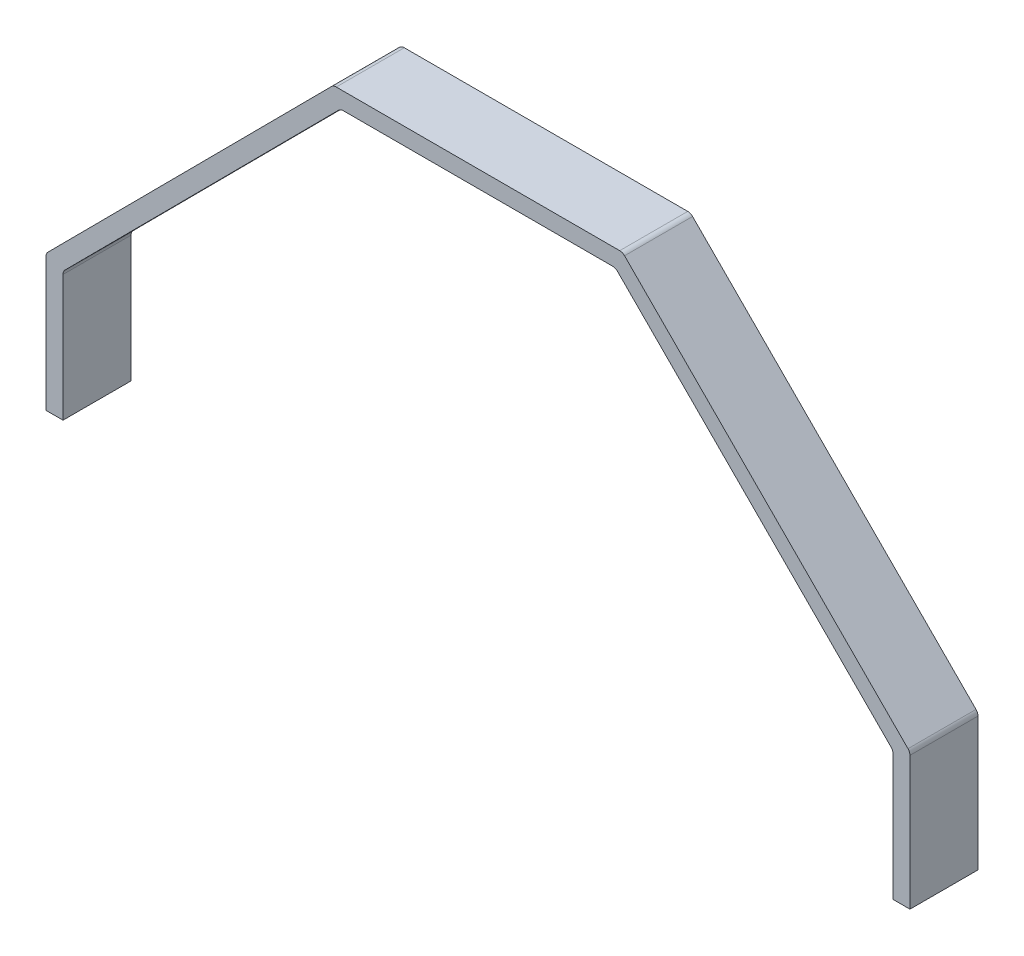
ISO-10303-21;
HEADER;
FILE_DESCRIPTION(('STEP AP214'),'2;1');
FILE_NAME('part.step','',(''),(''),'','','');
FILE_SCHEMA(('AUTOMOTIVE_DESIGN { 1 0 10303 214 1 1 1 1 }'));
ENDSEC;
DATA;
#1=APPLICATION_CONTEXT('core data for automotive mechanical design processes');
#2=APPLICATION_PROTOCOL_DEFINITION('international standard','automotive_design',2000,#1);
#3=PRODUCT_CONTEXT('',#1,'mechanical');
#4=PRODUCT('Part','Part','',(#3));
#5=PRODUCT_RELATED_PRODUCT_CATEGORY('part','',(#4));
#6=PRODUCT_DEFINITION_FORMATION('','',#4);
#7=PRODUCT_DEFINITION_CONTEXT('part definition',#1,'design');
#8=PRODUCT_DEFINITION('design','',#6,#7);
#9=PRODUCT_DEFINITION_SHAPE('','',#8);
#10=(LENGTH_UNIT() NAMED_UNIT(*) SI_UNIT(.MILLI.,.METRE.));
#11=(NAMED_UNIT(*) PLANE_ANGLE_UNIT() SI_UNIT($,.RADIAN.));
#12=(NAMED_UNIT(*) SI_UNIT($,.STERADIAN.) SOLID_ANGLE_UNIT());
#13=UNCERTAINTY_MEASURE_WITH_UNIT(LENGTH_MEASURE(1.E-05),#10,'distance_accuracy_value','');
#14=(GEOMETRIC_REPRESENTATION_CONTEXT(3) GLOBAL_UNCERTAINTY_ASSIGNED_CONTEXT((#13)) GLOBAL_UNIT_ASSIGNED_CONTEXT((#10,
#11,#12)) REPRESENTATION_CONTEXT('',''));
#15=CARTESIAN_POINT('',(0.,0.,0.));
#16=DIRECTION('',(0.,0.,1.));
#17=DIRECTION('',(1.,0.,0.));
#18=AXIS2_PLACEMENT_3D('',#15,#16,#17);
#19=CARTESIAN_POINT('',(127.,-85.,20.));
#20=DIRECTION('',(-1.,0.,0.));
#21=DIRECTION('',(0.,-1.,0.));
#22=AXIS2_PLACEMENT_3D('',#19,#20,#21);
#23=PLANE('',#22);
#24=DIRECTION('',(0.,1.,0.));
#25=VECTOR('',#24,1.);
#26=CARTESIAN_POINT('',(127.,-85.,0.));
#27=LINE('',#26,#25);
#28=CARTESIAN_POINT('',(127.,-125.,0.));
#29=VERTEX_POINT('',#28);
#30=CARTESIAN_POINT('',(127.,-85.8249732751518,0.));
#31=VERTEX_POINT('',#30);
#32=EDGE_CURVE('E220',#29,#31,#27,.T.);
#33=ORIENTED_EDGE('',*,*,#32,.T.);
#34=DIRECTION('',(0.,0.,-1.));
#35=VECTOR('',#34,1.);
#36=CARTESIAN_POINT('',(127.,-85.8249732751518,20.));
#37=LINE('',#36,#35);
#38=CARTESIAN_POINT('',(127.,-85.8249732751518,20.));
#39=VERTEX_POINT('',#38);
#40=EDGE_CURVE('E302',#31,#39,#37,.F.);
#41=ORIENTED_EDGE('',*,*,#40,.T.);
#42=DIRECTION('',(0.,1.,0.));
#43=VECTOR('',#42,1.);
#44=CARTESIAN_POINT('',(127.,-85.,20.));
#45=LINE('',#44,#43);
#46=CARTESIAN_POINT('',(127.,-125.,20.));
#47=VERTEX_POINT('',#46);
#48=EDGE_CURVE('E250',#47,#39,#45,.T.);
#49=ORIENTED_EDGE('',*,*,#48,.F.);
#50=DIRECTION('',(0.,0.,-1.));
#51=VECTOR('',#50,1.);
#52=CARTESIAN_POINT('',(127.,-125.,20.));
#53=LINE('',#52,#51);
#54=EDGE_CURVE('E219',#47,#29,#53,.T.);
#55=ORIENTED_EDGE('',*,*,#54,.T.);
#56=EDGE_LOOP('',(#33,#41,#49,#55));
#57=FACE_BOUND('',#56,.T.);
#58=ADVANCED_FACE('F37',(#57),#23,.F.);
#59=CARTESIAN_POINT('',(42.5,0.,20.));
#60=DIRECTION('',(-0.70918955635223,-0.70501785307957,0.));
#61=DIRECTION('',(0.70501785307957,-0.70918955635223,0.));
#62=AXIS2_PLACEMENT_3D('',#59,#60,#61);
#63=PLANE('',#62);
#64=DIRECTION('',(-0.70501785307957,0.70918955635223,0.));
#65=VECTOR('',#64,1.);
#66=CARTESIAN_POINT('',(42.5,0.,20.));
#67=LINE('',#66,#65);
#68=CARTESIAN_POINT('',(126.418379112704,-84.4149375689927,20.));
#69=VERTEX_POINT('',#68);
#70=CARTESIAN_POINT('',(43.0864939156418,-0.589964293840886,20.));
#71=VERTEX_POINT('',#70);
#72=EDGE_CURVE('E371',#69,#71,#67,.T.);
#73=ORIENTED_EDGE('',*,*,#72,.F.);
#74=DIRECTION('',(0.,0.,-1.));
#75=VECTOR('',#74,1.);
#76=CARTESIAN_POINT('',(126.418379112704,-84.4149375689927,20.));
#77=LINE('',#76,#75);
#78=CARTESIAN_POINT('',(126.418379112704,-84.4149375689927,0.));
#79=VERTEX_POINT('',#78);
#80=EDGE_CURVE('E299',#69,#79,#77,.T.);
#81=ORIENTED_EDGE('',*,*,#80,.T.);
#82=DIRECTION('',(-0.70501785307957,0.70918955635223,0.));
#83=VECTOR('',#82,1.);
#84=CARTESIAN_POINT('',(42.5,0.,0.));
#85=LINE('',#84,#83);
#86=CARTESIAN_POINT('',(43.0864939156418,-0.589964293840886,0.));
#87=VERTEX_POINT('',#86);
#88=EDGE_CURVE('E223',#79,#87,#85,.T.);
#89=ORIENTED_EDGE('',*,*,#88,.T.);
#90=DIRECTION('',(0.,0.,-1.));
#91=VECTOR('',#90,1.);
#92=CARTESIAN_POINT('',(43.0864939156418,-0.589964293840886,20.));
#93=LINE('',#92,#91);
#94=EDGE_CURVE('E297',#87,#71,#93,.F.);
#95=ORIENTED_EDGE('',*,*,#94,.T.);
#96=EDGE_LOOP('',(#73,#81,#89,#95));
#97=FACE_BOUND('',#96,.T.);
#98=ADVANCED_FACE('F379',(#97),#63,.F.);
#99=CARTESIAN_POINT('',(42.5,0.,20.));
#100=DIRECTION('',(0.,-1.,0.));
#101=DIRECTION('',(1.,0.,0.));
#102=AXIS2_PLACEMENT_3D('',#99,#100,#101);
#103=PLANE('',#102);
#104=DIRECTION('',(-1.,0.,0.));
#105=VECTOR('',#104,1.);
#106=CARTESIAN_POINT('',(42.5,0.,0.));
#107=LINE('',#106,#105);
#108=CARTESIAN_POINT('',(41.6681148029373,0.,0.));
#109=VERTEX_POINT('',#108);
#110=CARTESIAN_POINT('',(-41.6681148029373,0.,0.));
#111=VERTEX_POINT('',#110);
#112=EDGE_CURVE('E226',#109,#111,#107,.T.);
#113=ORIENTED_EDGE('',*,*,#112,.T.);
#114=DIRECTION('',(0.,0.,-1.));
#115=VECTOR('',#114,1.);
#116=CARTESIAN_POINT('',(-41.6681148029373,0.,20.));
#117=LINE('',#116,#115);
#118=CARTESIAN_POINT('',(-41.6681148029373,0.,20.));
#119=VERTEX_POINT('',#118);
#120=EDGE_CURVE('E52',#111,#119,#117,.F.);
#121=ORIENTED_EDGE('',*,*,#120,.T.);
#122=DIRECTION('',(-1.,0.,0.));
#123=VECTOR('',#122,1.);
#124=CARTESIAN_POINT('',(42.5,0.,20.));
#125=LINE('',#124,#123);
#126=CARTESIAN_POINT('',(41.6681148029373,0.,20.));
#127=VERTEX_POINT('',#126);
#128=EDGE_CURVE('E386',#127,#119,#125,.T.);
#129=ORIENTED_EDGE('',*,*,#128,.F.);
#130=DIRECTION('',(0.,0.,-1.));
#131=VECTOR('',#130,1.);
#132=CARTESIAN_POINT('',(41.6681148029373,0.,20.));
#133=LINE('',#132,#131);
#134=EDGE_CURVE('E304',#127,#109,#133,.T.);
#135=ORIENTED_EDGE('',*,*,#134,.T.);
#136=EDGE_LOOP('',(#113,#121,#129,#135));
#137=FACE_BOUND('',#136,.T.);
#138=ADVANCED_FACE('F385',(#137),#103,.F.);
#139=CARTESIAN_POINT('',(-42.5,0.,20.));
#140=DIRECTION('',(0.709189556352231,-0.70501785307957,0.));
#141=DIRECTION('',(0.70501785307957,0.709189556352231,0.));
#142=AXIS2_PLACEMENT_3D('',#139,#140,#141);
#143=PLANE('',#142);
#144=DIRECTION('',(-0.70501785307957,-0.709189556352231,0.));
#145=VECTOR('',#144,1.);
#146=CARTESIAN_POINT('',(-42.5,0.,0.));
#147=LINE('',#146,#145);
#148=CARTESIAN_POINT('',(-43.0864939156418,-0.589964293840876,0.));
#149=VERTEX_POINT('',#148);
#150=CARTESIAN_POINT('',(-126.418379112704,-84.4149375689927,0.));
#151=VERTEX_POINT('',#150);
#152=EDGE_CURVE('E228',#149,#151,#147,.T.);
#153=ORIENTED_EDGE('',*,*,#152,.T.);
#154=DIRECTION('',(0.,0.,-1.));
#155=VECTOR('',#154,1.);
#156=CARTESIAN_POINT('',(-126.418379112704,-84.4149375689927,20.));
#157=LINE('',#156,#155);
#158=CARTESIAN_POINT('',(-126.418379112704,-84.4149375689927,20.));
#159=VERTEX_POINT('',#158);
#160=EDGE_CURVE('E289',#151,#159,#157,.F.);
#161=ORIENTED_EDGE('',*,*,#160,.T.);
#162=DIRECTION('',(-0.70501785307957,-0.709189556352231,0.));
#163=VECTOR('',#162,1.);
#164=CARTESIAN_POINT('',(-42.5,0.,20.));
#165=LINE('',#164,#163);
#166=CARTESIAN_POINT('',(-43.0864939156418,-0.589964293840876,20.));
#167=VERTEX_POINT('',#166);
#168=EDGE_CURVE('E186',#167,#159,#165,.T.);
#169=ORIENTED_EDGE('',*,*,#168,.F.);
#170=DIRECTION('',(0.,0.,-1.));
#171=VECTOR('',#170,1.);
#172=CARTESIAN_POINT('',(-43.0864939156418,-0.589964293840875,20.));
#173=LINE('',#172,#171);
#174=EDGE_CURVE('E286',#167,#149,#173,.T.);
#175=ORIENTED_EDGE('',*,*,#174,.T.);
#176=EDGE_LOOP('',(#153,#161,#169,#175));
#177=FACE_BOUND('',#176,.T.);
#178=ADVANCED_FACE('F397',(#177),#143,.F.);
#179=CARTESIAN_POINT('',(-127.,-85.,20.));
#180=DIRECTION('',(1.,0.,0.));
#181=DIRECTION('',(0.,0.,-1.));
#182=AXIS2_PLACEMENT_3D('',#179,#180,#181);
#183=PLANE('',#182);
#184=DIRECTION('',(0.,-1.,0.));
#185=VECTOR('',#184,1.);
#186=CARTESIAN_POINT('',(-127.,-85.,20.));
#187=LINE('',#186,#185);
#188=CARTESIAN_POINT('',(-127.,-85.8249732751518,20.));
#189=VERTEX_POINT('',#188);
#190=CARTESIAN_POINT('',(-127.,-125.,20.));
#191=VERTEX_POINT('',#190);
#192=EDGE_CURVE('E173',#189,#191,#187,.T.);
#193=ORIENTED_EDGE('',*,*,#192,.F.);
#194=DIRECTION('',(0.,0.,-1.));
#195=VECTOR('',#194,1.);
#196=CARTESIAN_POINT('',(-127.,-85.8249732751518,20.));
#197=LINE('',#196,#195);
#198=CARTESIAN_POINT('',(-127.,-85.8249732751518,0.));
#199=VERTEX_POINT('',#198);
#200=EDGE_CURVE('E276',#189,#199,#197,.T.);
#201=ORIENTED_EDGE('',*,*,#200,.T.);
#202=DIRECTION('',(0.,-1.,0.));
#203=VECTOR('',#202,1.);
#204=CARTESIAN_POINT('',(-127.,-85.,0.));
#205=LINE('',#204,#203);
#206=CARTESIAN_POINT('',(-127.,-125.,0.));
#207=VERTEX_POINT('',#206);
#208=EDGE_CURVE('E192',#199,#207,#205,.T.);
#209=ORIENTED_EDGE('',*,*,#208,.T.);
#210=DIRECTION('',(0.,0.,-1.));
#211=VECTOR('',#210,1.);
#212=CARTESIAN_POINT('',(-127.,-125.,20.));
#213=LINE('',#212,#211);
#214=EDGE_CURVE('E189',#191,#207,#213,.T.);
#215=ORIENTED_EDGE('',*,*,#214,.F.);
#216=EDGE_LOOP('',(#193,#201,#209,#215));
#217=FACE_BOUND('',#216,.T.);
#218=ADVANCED_FACE('F190',(#217),#183,.F.);
#219=CARTESIAN_POINT('',(-127.,-125.,20.));
#220=DIRECTION('',(0.,1.,0.));
#221=DIRECTION('',(0.,0.,1.));
#222=AXIS2_PLACEMENT_3D('',#219,#220,#221);
#223=PLANE('',#222);
#224=DIRECTION('',(1.,0.,0.));
#225=VECTOR('',#224,1.);
#226=CARTESIAN_POINT('',(-127.,-125.,0.));
#227=LINE('',#226,#225);
#228=CARTESIAN_POINT('',(-122.,-125.,0.));
#229=VERTEX_POINT('',#228);
#230=EDGE_CURVE('E232',#207,#229,#227,.T.);
#231=ORIENTED_EDGE('',*,*,#230,.T.);
#232=DIRECTION('',(0.,0.,-1.));
#233=VECTOR('',#232,1.);
#234=CARTESIAN_POINT('',(-122.,-125.,20.));
#235=LINE('',#234,#233);
#236=CARTESIAN_POINT('',(-122.,-125.,20.));
#237=VERTEX_POINT('',#236);
#238=EDGE_CURVE('E196',#237,#229,#235,.T.);
#239=ORIENTED_EDGE('',*,*,#238,.F.);
#240=DIRECTION('',(1.,0.,0.));
#241=VECTOR('',#240,1.);
#242=CARTESIAN_POINT('',(-127.,-125.,20.));
#243=LINE('',#242,#241);
#244=EDGE_CURVE('E179',#191,#237,#243,.T.);
#245=ORIENTED_EDGE('',*,*,#244,.F.);
#246=ORIENTED_EDGE('',*,*,#214,.T.);
#247=EDGE_LOOP('',(#231,#239,#245,#246));
#248=FACE_BOUND('',#247,.T.);
#249=ADVANCED_FACE('F198',(#248),#223,.F.);
#250=CARTESIAN_POINT('',(-122.,-87.0624331878795,20.));
#251=DIRECTION('',(-1.,0.,0.));
#252=DIRECTION('',(0.,0.,1.));
#253=AXIS2_PLACEMENT_3D('',#250,#251,#252);
#254=PLANE('',#253);
#255=DIRECTION('',(0.,1.,0.));
#256=VECTOR('',#255,1.);
#257=CARTESIAN_POINT('',(-122.,-87.0624331878795,0.));
#258=LINE('',#257,#256);
#259=CARTESIAN_POINT('',(-122.,-87.8874064630313,0.));
#260=VERTEX_POINT('',#259);
#261=EDGE_CURVE('E234',#229,#260,#258,.T.);
#262=ORIENTED_EDGE('',*,*,#261,.T.);
#263=DIRECTION('',(0.,0.,-1.));
#264=VECTOR('',#263,1.);
#265=CARTESIAN_POINT('',(-122.,-87.8874064630313,20.));
#266=LINE('',#265,#264);
#267=CARTESIAN_POINT('',(-122.,-87.8874064630313,20.));
#268=VERTEX_POINT('',#267);
#269=EDGE_CURVE('E274',#260,#268,#266,.F.);
#270=ORIENTED_EDGE('',*,*,#269,.T.);
#271=DIRECTION('',(0.,1.,0.));
#272=VECTOR('',#271,1.);
#273=CARTESIAN_POINT('',(-122.,-87.0624331878795,20.));
#274=LINE('',#273,#272);
#275=EDGE_CURVE('E201',#237,#268,#274,.T.);
#276=ORIENTED_EDGE('',*,*,#275,.F.);
#277=ORIENTED_EDGE('',*,*,#238,.T.);
#278=EDGE_LOOP('',(#262,#270,#276,#277));
#279=FACE_BOUND('',#278,.T.);
#280=ADVANCED_FACE('F327',(#279),#254,.F.);
#281=CARTESIAN_POINT('',(-40.4202870073434,-5.00000000000002,20.));
#282=DIRECTION('',(-0.709189556352231,0.70501785307957,0.));
#283=DIRECTION('',(-0.70501785307957,-0.709189556352231,0.));
#284=AXIS2_PLACEMENT_3D('',#281,#282,#283);
#285=PLANE('',#284);
#286=DIRECTION('',(0.70501785307957,0.709189556352231,0.));
#287=VECTOR('',#286,1.);
#288=CARTESIAN_POINT('',(-40.4202870073434,-5.00000000000002,0.));
#289=LINE('',#288,#287);
#290=CARTESIAN_POINT('',(-121.418379112704,-86.4773707568722,0.));
#291=VERTEX_POINT('',#290);
#292=CARTESIAN_POINT('',(-41.0067809229852,-5.58996429384088,0.));
#293=VERTEX_POINT('',#292);
#294=EDGE_CURVE('E237',#291,#293,#289,.T.);
#295=ORIENTED_EDGE('',*,*,#294,.T.);
#296=DIRECTION('',(0.,0.,-1.));
#297=VECTOR('',#296,1.);
#298=CARTESIAN_POINT('',(-41.0067809229852,-5.58996429384088,20.));
#299=LINE('',#298,#297);
#300=CARTESIAN_POINT('',(-41.0067809229852,-5.58996429384088,20.));
#301=VERTEX_POINT('',#300);
#302=EDGE_CURVE('E272',#293,#301,#299,.F.);
#303=ORIENTED_EDGE('',*,*,#302,.T.);
#304=DIRECTION('',(0.70501785307957,0.709189556352231,0.));
#305=VECTOR('',#304,1.);
#306=CARTESIAN_POINT('',(-40.4202870073434,-5.00000000000002,20.));
#307=LINE('',#306,#305);
#308=CARTESIAN_POINT('',(-121.418379112704,-86.4773707568722,20.));
#309=VERTEX_POINT('',#308);
#310=EDGE_CURVE('E203',#309,#301,#307,.T.);
#311=ORIENTED_EDGE('',*,*,#310,.F.);
#312=DIRECTION('',(0.,0.,-1.));
#313=VECTOR('',#312,1.);
#314=CARTESIAN_POINT('',(-121.418379112704,-86.4773707568722,0.));
#315=LINE('',#314,#313);
#316=EDGE_CURVE('E269',#309,#291,#315,.T.);
#317=ORIENTED_EDGE('',*,*,#316,.T.);
#318=EDGE_LOOP('',(#295,#303,#311,#317));
#319=FACE_BOUND('',#318,.T.);
#320=ADVANCED_FACE('F333',(#319),#285,.F.);
#321=CARTESIAN_POINT('',(40.4202870073434,-5.00000000000002,20.));
#322=DIRECTION('',(0.,1.,0.));
#323=DIRECTION('',(0.,0.,1.));
#324=AXIS2_PLACEMENT_3D('',#321,#322,#323);
#325=PLANE('',#324);
#326=DIRECTION('',(1.,0.,0.));
#327=VECTOR('',#326,1.);
#328=CARTESIAN_POINT('',(40.4202870073434,-5.00000000000002,0.));
#329=LINE('',#328,#327);
#330=CARTESIAN_POINT('',(-39.5884018102807,-5.00000000000002,0.));
#331=VERTEX_POINT('',#330);
#332=CARTESIAN_POINT('',(39.5884018102807,-5.00000000000002,0.));
#333=VERTEX_POINT('',#332);
#334=EDGE_CURVE('E240',#331,#333,#329,.T.);
#335=ORIENTED_EDGE('',*,*,#334,.T.);
#336=DIRECTION('',(0.,0.,-1.));
#337=VECTOR('',#336,1.);
#338=CARTESIAN_POINT('',(39.5884018102807,-5.00000000000002,20.));
#339=LINE('',#338,#337);
#340=CARTESIAN_POINT('',(39.5884018102807,-5.00000000000002,20.));
#341=VERTEX_POINT('',#340);
#342=EDGE_CURVE('E267',#333,#341,#339,.F.);
#343=ORIENTED_EDGE('',*,*,#342,.T.);
#344=DIRECTION('',(1.,0.,0.));
#345=VECTOR('',#344,1.);
#346=CARTESIAN_POINT('',(40.4202870073434,-5.00000000000002,20.));
#347=LINE('',#346,#345);
#348=CARTESIAN_POINT('',(-39.5884018102807,-5.00000000000002,20.));
#349=VERTEX_POINT('',#348);
#350=EDGE_CURVE('E209',#349,#341,#347,.T.);
#351=ORIENTED_EDGE('',*,*,#350,.F.);
#352=DIRECTION('',(0.,0.,-1.));
#353=VECTOR('',#352,1.);
#354=CARTESIAN_POINT('',(-39.5884018102807,-5.00000000000002,0.));
#355=LINE('',#354,#353);
#356=EDGE_CURVE('E264',#349,#331,#355,.T.);
#357=ORIENTED_EDGE('',*,*,#356,.T.);
#358=EDGE_LOOP('',(#335,#343,#351,#357));
#359=FACE_BOUND('',#358,.T.);
#360=ADVANCED_FACE('F341',(#359),#325,.F.);
#361=CARTESIAN_POINT('',(40.4202870073434,-5.00000000000002,20.));
#362=DIRECTION('',(0.70918955635223,0.70501785307957,0.));
#363=DIRECTION('',(-0.70501785307957,0.70918955635223,0.));
#364=AXIS2_PLACEMENT_3D('',#361,#362,#363);
#365=PLANE('',#364);
#366=DIRECTION('',(0.70501785307957,-0.70918955635223,0.));
#367=VECTOR('',#366,1.);
#368=CARTESIAN_POINT('',(40.4202870073434,-5.00000000000002,0.));
#369=LINE('',#368,#367);
#370=CARTESIAN_POINT('',(41.0067809229852,-5.58996429384089,0.));
#371=VERTEX_POINT('',#370);
#372=CARTESIAN_POINT('',(121.418379112704,-86.4773707568721,0.));
#373=VERTEX_POINT('',#372);
#374=EDGE_CURVE('E243',#371,#373,#369,.T.);
#375=ORIENTED_EDGE('',*,*,#374,.T.);
#376=DIRECTION('',(0.,0.,-1.));
#377=VECTOR('',#376,1.);
#378=CARTESIAN_POINT('',(121.418379112704,-86.4773707568721,20.));
#379=LINE('',#378,#377);
#380=CARTESIAN_POINT('',(121.418379112704,-86.4773707568721,20.));
#381=VERTEX_POINT('',#380);
#382=EDGE_CURVE('E262',#373,#381,#379,.F.);
#383=ORIENTED_EDGE('',*,*,#382,.T.);
#384=DIRECTION('',(0.70501785307957,-0.70918955635223,0.));
#385=VECTOR('',#384,1.);
#386=CARTESIAN_POINT('',(40.4202870073434,-5.00000000000002,20.));
#387=LINE('',#386,#385);
#388=CARTESIAN_POINT('',(41.0067809229852,-5.58996429384089,20.));
#389=VERTEX_POINT('',#388);
#390=EDGE_CURVE('E212',#389,#381,#387,.T.);
#391=ORIENTED_EDGE('',*,*,#390,.F.);
#392=DIRECTION('',(0.,0.,-1.));
#393=VECTOR('',#392,1.);
#394=CARTESIAN_POINT('',(41.0067809229852,-5.58996429384088,0.));
#395=LINE('',#394,#393);
#396=EDGE_CURVE('E259',#389,#371,#395,.T.);
#397=ORIENTED_EDGE('',*,*,#396,.T.);
#398=EDGE_LOOP('',(#375,#383,#391,#397));
#399=FACE_BOUND('',#398,.T.);
#400=ADVANCED_FACE('F350',(#399),#365,.F.);
#401=CARTESIAN_POINT('',(122.,-87.0624331878795,20.));
#402=DIRECTION('',(1.,0.,0.));
#403=DIRECTION('',(0.,0.,-1.));
#404=AXIS2_PLACEMENT_3D('',#401,#402,#403);
#405=PLANE('',#404);
#406=DIRECTION('',(0.,-1.,0.));
#407=VECTOR('',#406,1.);
#408=CARTESIAN_POINT('',(122.,-87.0624331878795,20.));
#409=LINE('',#408,#407);
#410=CARTESIAN_POINT('',(122.,-87.8874064630313,20.));
#411=VERTEX_POINT('',#410);
#412=CARTESIAN_POINT('',(122.,-125.,20.));
#413=VERTEX_POINT('',#412);
#414=EDGE_CURVE('E215',#411,#413,#409,.T.);
#415=ORIENTED_EDGE('',*,*,#414,.F.);
#416=DIRECTION('',(0.,0.,-1.));
#417=VECTOR('',#416,1.);
#418=CARTESIAN_POINT('',(122.,-87.8874064630313,0.));
#419=LINE('',#418,#417);
#420=CARTESIAN_POINT('',(122.,-87.8874064630313,0.));
#421=VERTEX_POINT('',#420);
#422=EDGE_CURVE('E195',#411,#421,#419,.T.);
#423=ORIENTED_EDGE('',*,*,#422,.T.);
#424=DIRECTION('',(0.,-1.,0.));
#425=VECTOR('',#424,1.);
#426=CARTESIAN_POINT('',(122.,-87.0624331878795,0.));
#427=LINE('',#426,#425);
#428=CARTESIAN_POINT('',(122.,-125.,0.));
#429=VERTEX_POINT('',#428);
#430=EDGE_CURVE('E246',#421,#429,#427,.T.);
#431=ORIENTED_EDGE('',*,*,#430,.T.);
#432=DIRECTION('',(0.,0.,-1.));
#433=VECTOR('',#432,1.);
#434=CARTESIAN_POINT('',(122.,-125.,20.));
#435=LINE('',#434,#433);
#436=EDGE_CURVE('E253',#413,#429,#435,.T.);
#437=ORIENTED_EDGE('',*,*,#436,.F.);
#438=EDGE_LOOP('',(#415,#423,#431,#437));
#439=FACE_BOUND('',#438,.T.);
#440=ADVANCED_FACE('F359',(#439),#405,.F.);
#441=CARTESIAN_POINT('',(122.,-125.,20.));
#442=DIRECTION('',(0.,1.,0.));
#443=DIRECTION('',(0.,0.,1.));
#444=AXIS2_PLACEMENT_3D('',#441,#442,#443);
#445=PLANE('',#444);
#446=DIRECTION('',(1.,0.,0.));
#447=VECTOR('',#446,1.);
#448=CARTESIAN_POINT('',(122.,-125.,0.));
#449=LINE('',#448,#447);
#450=EDGE_CURVE('E248',#429,#29,#449,.T.);
#451=ORIENTED_EDGE('',*,*,#450,.T.);
#452=ORIENTED_EDGE('',*,*,#54,.F.);
#453=DIRECTION('',(1.,0.,0.));
#454=VECTOR('',#453,1.);
#455=CARTESIAN_POINT('',(122.,-125.,20.));
#456=LINE('',#455,#454);
#457=EDGE_CURVE('E217',#413,#47,#456,.T.);
#458=ORIENTED_EDGE('',*,*,#457,.F.);
#459=ORIENTED_EDGE('',*,*,#436,.T.);
#460=EDGE_LOOP('',(#451,#452,#458,#459));
#461=FACE_BOUND('',#460,.T.);
#462=ADVANCED_FACE('F365',(#461),#445,.F.);
#463=CARTESIAN_POINT('',(0.,0.,20.));
#464=DIRECTION('',(0.,0.,1.));
#465=DIRECTION('',(1.,0.,0.));
#466=AXIS2_PLACEMENT_3D('',#463,#464,#465);
#467=PLANE('',#466);
#468=ORIENTED_EDGE('',*,*,#168,.T.);
#469=CARTESIAN_POINT('',(-125.,-85.8249732751518,20.));
#470=DIRECTION('',(0.,0.,1.));
#471=DIRECTION('',(1.,0.,0.));
#472=AXIS2_PLACEMENT_3D('',#469,#470,#471);
#473=CIRCLE('',#472,2.);
#474=EDGE_CURVE('E182',#159,#189,#473,.T.);
#475=ORIENTED_EDGE('',*,*,#474,.T.);
#476=ORIENTED_EDGE('',*,*,#192,.T.);
#477=ORIENTED_EDGE('',*,*,#244,.T.);
#478=ORIENTED_EDGE('',*,*,#275,.T.);
#479=CARTESIAN_POINT('',(-120.,-87.8874064630313,20.));
#480=DIRECTION('',(0.,0.,1.));
#481=DIRECTION('',(1.,0.,0.));
#482=AXIS2_PLACEMENT_3D('',#479,#480,#481);
#483=CIRCLE('',#482,2.);
#484=EDGE_CURVE('E11',#268,#309,#483,.F.);
#485=ORIENTED_EDGE('',*,*,#484,.T.);
#486=ORIENTED_EDGE('',*,*,#310,.T.);
#487=CARTESIAN_POINT('',(-39.5884018102807,-7.00000000000002,20.));
#488=DIRECTION('',(0.,0.,1.));
#489=DIRECTION('',(1.,0.,0.));
#490=AXIS2_PLACEMENT_3D('',#487,#488,#489);
#491=CIRCLE('',#490,2.);
#492=EDGE_CURVE('E318',#301,#349,#491,.F.);
#493=ORIENTED_EDGE('',*,*,#492,.T.);
#494=ORIENTED_EDGE('',*,*,#350,.T.);
#495=CARTESIAN_POINT('',(39.5884018102807,-7.00000000000002,20.));
#496=DIRECTION('',(0.,0.,1.));
#497=DIRECTION('',(1.,0.,0.));
#498=AXIS2_PLACEMENT_3D('',#495,#496,#497);
#499=CIRCLE('',#498,2.);
#500=EDGE_CURVE('E314',#341,#389,#499,.F.);
#501=ORIENTED_EDGE('',*,*,#500,.T.);
#502=ORIENTED_EDGE('',*,*,#390,.T.);
#503=CARTESIAN_POINT('',(120.,-87.8874064630313,20.));
#504=DIRECTION('',(0.,0.,1.));
#505=DIRECTION('',(1.,0.,0.));
#506=AXIS2_PLACEMENT_3D('',#503,#504,#505);
#507=CIRCLE('',#506,2.);
#508=EDGE_CURVE('E310',#381,#411,#507,.F.);
#509=ORIENTED_EDGE('',*,*,#508,.T.);
#510=ORIENTED_EDGE('',*,*,#414,.T.);
#511=ORIENTED_EDGE('',*,*,#457,.T.);
#512=ORIENTED_EDGE('',*,*,#48,.T.);
#513=CARTESIAN_POINT('',(125.,-85.8249732751518,20.));
#514=DIRECTION('',(0.,0.,1.));
#515=DIRECTION('',(1.,0.,0.));
#516=AXIS2_PLACEMENT_3D('',#513,#514,#515);
#517=CIRCLE('',#516,2.);
#518=EDGE_CURVE('E294',#39,#69,#517,.T.);
#519=ORIENTED_EDGE('',*,*,#518,.T.);
#520=ORIENTED_EDGE('',*,*,#72,.T.);
#521=CARTESIAN_POINT('',(41.6681148029373,-2.00000000000002,20.));
#522=DIRECTION('',(0.,0.,1.));
#523=DIRECTION('',(1.,0.,0.));
#524=AXIS2_PLACEMENT_3D('',#521,#522,#523);
#525=CIRCLE('',#524,2.);
#526=EDGE_CURVE('E59',#71,#127,#525,.T.);
#527=ORIENTED_EDGE('',*,*,#526,.T.);
#528=ORIENTED_EDGE('',*,*,#128,.T.);
#529=CARTESIAN_POINT('',(-41.6681148029373,-2.00000000000001,20.));
#530=DIRECTION('',(0.,0.,1.));
#531=DIRECTION('',(1.,0.,0.));
#532=AXIS2_PLACEMENT_3D('',#529,#530,#531);
#533=CIRCLE('',#532,2.);
#534=EDGE_CURVE('E292',#119,#167,#533,.T.);
#535=ORIENTED_EDGE('',*,*,#534,.T.);
#536=EDGE_LOOP('',(#468,#475,#476,#477,#478,#485,#486,#493,#494,#501,#502,#509,#510,#511,#512,
#519,#520,#527,#528,#535));
#537=FACE_BOUND('',#536,.T.);
#538=ADVANCED_FACE('F176',(#537),#467,.T.);
#539=CARTESIAN_POINT('',(0.,0.,0.));
#540=DIRECTION('',(0.,0.,1.));
#541=DIRECTION('',(1.,0.,0.));
#542=AXIS2_PLACEMENT_3D('',#539,#540,#541);
#543=PLANE('',#542);
#544=ORIENTED_EDGE('',*,*,#208,.F.);
#545=CARTESIAN_POINT('',(-125.,-85.8249732751518,0.));
#546=DIRECTION('',(0.,0.,1.));
#547=DIRECTION('',(1.,0.,0.));
#548=AXIS2_PLACEMENT_3D('',#545,#546,#547);
#549=CIRCLE('',#548,2.);
#550=EDGE_CURVE('E284',#199,#151,#549,.F.);
#551=ORIENTED_EDGE('',*,*,#550,.T.);
#552=ORIENTED_EDGE('',*,*,#152,.F.);
#553=CARTESIAN_POINT('',(-41.6681148029373,-2.00000000000001,0.));
#554=DIRECTION('',(0.,0.,1.));
#555=DIRECTION('',(1.,0.,0.));
#556=AXIS2_PLACEMENT_3D('',#553,#554,#555);
#557=CIRCLE('',#556,2.);
#558=EDGE_CURVE('E280',#149,#111,#557,.F.);
#559=ORIENTED_EDGE('',*,*,#558,.T.);
#560=ORIENTED_EDGE('',*,*,#112,.F.);
#561=CARTESIAN_POINT('',(41.6681148029373,-2.00000000000002,0.));
#562=DIRECTION('',(0.,0.,1.));
#563=DIRECTION('',(1.,0.,0.));
#564=AXIS2_PLACEMENT_3D('',#561,#562,#563);
#565=CIRCLE('',#564,2.);
#566=EDGE_CURVE('E278',#109,#87,#565,.F.);
#567=ORIENTED_EDGE('',*,*,#566,.T.);
#568=ORIENTED_EDGE('',*,*,#88,.F.);
#569=CARTESIAN_POINT('',(125.,-85.8249732751518,0.));
#570=DIRECTION('',(0.,0.,1.));
#571=DIRECTION('',(1.,0.,0.));
#572=AXIS2_PLACEMENT_3D('',#569,#570,#571);
#573=CIRCLE('',#572,2.);
#574=EDGE_CURVE('E282',#79,#31,#573,.F.);
#575=ORIENTED_EDGE('',*,*,#574,.T.);
#576=ORIENTED_EDGE('',*,*,#32,.F.);
#577=ORIENTED_EDGE('',*,*,#450,.F.);
#578=ORIENTED_EDGE('',*,*,#430,.F.);
#579=CARTESIAN_POINT('',(120.,-87.8874064630313,0.));
#580=DIRECTION('',(0.,0.,1.));
#581=DIRECTION('',(1.,0.,0.));
#582=AXIS2_PLACEMENT_3D('',#579,#580,#581);
#583=CIRCLE('',#582,2.);
#584=EDGE_CURVE('E308',#421,#373,#583,.T.);
#585=ORIENTED_EDGE('',*,*,#584,.T.);
#586=ORIENTED_EDGE('',*,*,#374,.F.);
#587=CARTESIAN_POINT('',(39.5884018102807,-7.00000000000002,0.));
#588=DIRECTION('',(0.,0.,1.));
#589=DIRECTION('',(1.,0.,0.));
#590=AXIS2_PLACEMENT_3D('',#587,#588,#589);
#591=CIRCLE('',#590,2.);
#592=EDGE_CURVE('E312',#371,#333,#591,.T.);
#593=ORIENTED_EDGE('',*,*,#592,.T.);
#594=ORIENTED_EDGE('',*,*,#334,.F.);
#595=CARTESIAN_POINT('',(-39.5884018102807,-7.00000000000002,0.));
#596=DIRECTION('',(0.,0.,1.));
#597=DIRECTION('',(1.,0.,0.));
#598=AXIS2_PLACEMENT_3D('',#595,#596,#597);
#599=CIRCLE('',#598,2.);
#600=EDGE_CURVE('E316',#331,#293,#599,.T.);
#601=ORIENTED_EDGE('',*,*,#600,.T.);
#602=ORIENTED_EDGE('',*,*,#294,.F.);
#603=CARTESIAN_POINT('',(-120.,-87.8874064630313,0.));
#604=DIRECTION('',(0.,0.,1.));
#605=DIRECTION('',(1.,0.,0.));
#606=AXIS2_PLACEMENT_3D('',#603,#604,#605);
#607=CIRCLE('',#606,2.);
#608=EDGE_CURVE('E45',#291,#260,#607,.T.);
#609=ORIENTED_EDGE('',*,*,#608,.T.);
#610=ORIENTED_EDGE('',*,*,#261,.F.);
#611=ORIENTED_EDGE('',*,*,#230,.F.);
#612=EDGE_LOOP('',(#544,#551,#552,#559,#560,#567,#568,#575,#576,#577,#578,#585,#586,#593,#594,
#601,#602,#609,#610,#611));
#613=FACE_BOUND('',#612,.T.);
#614=ADVANCED_FACE('F322',(#613),#543,.F.);
#615=CARTESIAN_POINT('',(120.,-87.8874064630313,20.));
#616=DIRECTION('',(0.,0.,1.));
#617=DIRECTION('',(1.,0.,0.));
#618=AXIS2_PLACEMENT_3D('',#615,#616,#617);
#619=CYLINDRICAL_SURFACE('',#618,2.);
#620=ORIENTED_EDGE('',*,*,#508,.F.);
#621=ORIENTED_EDGE('',*,*,#382,.F.);
#622=ORIENTED_EDGE('',*,*,#584,.F.);
#623=ORIENTED_EDGE('',*,*,#422,.F.);
#624=EDGE_LOOP('',(#620,#621,#622,#623));
#625=FACE_BOUND('',#624,.T.);
#626=ADVANCED_FACE('F354',(#625),#619,.F.);
#627=CARTESIAN_POINT('',(39.5884018102807,-7.00000000000002,20.));
#628=DIRECTION('',(0.,0.,1.));
#629=DIRECTION('',(1.,0.,0.));
#630=AXIS2_PLACEMENT_3D('',#627,#628,#629);
#631=CYLINDRICAL_SURFACE('',#630,2.);
#632=ORIENTED_EDGE('',*,*,#500,.F.);
#633=ORIENTED_EDGE('',*,*,#342,.F.);
#634=ORIENTED_EDGE('',*,*,#592,.F.);
#635=ORIENTED_EDGE('',*,*,#396,.F.);
#636=EDGE_LOOP('',(#632,#633,#634,#635));
#637=FACE_BOUND('',#636,.T.);
#638=ADVANCED_FACE('F345',(#637),#631,.F.);
#639=CARTESIAN_POINT('',(-39.5884018102807,-7.00000000000002,20.));
#640=DIRECTION('',(0.,0.,1.));
#641=DIRECTION('',(1.,0.,0.));
#642=AXIS2_PLACEMENT_3D('',#639,#640,#641);
#643=CYLINDRICAL_SURFACE('',#642,2.);
#644=ORIENTED_EDGE('',*,*,#492,.F.);
#645=ORIENTED_EDGE('',*,*,#302,.F.);
#646=ORIENTED_EDGE('',*,*,#600,.F.);
#647=ORIENTED_EDGE('',*,*,#356,.F.);
#648=EDGE_LOOP('',(#644,#645,#646,#647));
#649=FACE_BOUND('',#648,.T.);
#650=ADVANCED_FACE('F336',(#649),#643,.F.);
#651=CARTESIAN_POINT('',(-120.,-87.8874064630313,20.));
#652=DIRECTION('',(0.,0.,1.));
#653=DIRECTION('',(1.,0.,0.));
#654=AXIS2_PLACEMENT_3D('',#651,#652,#653);
#655=CYLINDRICAL_SURFACE('',#654,2.);
#656=ORIENTED_EDGE('',*,*,#484,.F.);
#657=ORIENTED_EDGE('',*,*,#269,.F.);
#658=ORIENTED_EDGE('',*,*,#608,.F.);
#659=ORIENTED_EDGE('',*,*,#316,.F.);
#660=EDGE_LOOP('',(#656,#657,#658,#659));
#661=FACE_BOUND('',#660,.T.);
#662=ADVANCED_FACE('F329',(#661),#655,.F.);
#663=CARTESIAN_POINT('',(-125.,-85.8249732751518,20.));
#664=DIRECTION('',(0.,0.,-1.));
#665=DIRECTION('',(-1.,0.,0.));
#666=AXIS2_PLACEMENT_3D('',#663,#664,#665);
#667=CYLINDRICAL_SURFACE('',#666,2.);
#668=ORIENTED_EDGE('',*,*,#474,.F.);
#669=ORIENTED_EDGE('',*,*,#160,.F.);
#670=ORIENTED_EDGE('',*,*,#550,.F.);
#671=ORIENTED_EDGE('',*,*,#200,.F.);
#672=EDGE_LOOP('',(#668,#669,#670,#671));
#673=FACE_BOUND('',#672,.T.);
#674=ADVANCED_FACE('F395',(#673),#667,.T.);
#675=CARTESIAN_POINT('',(125.,-85.8249732751518,20.));
#676=DIRECTION('',(0.,0.,-1.));
#677=DIRECTION('',(-1.,0.,0.));
#678=AXIS2_PLACEMENT_3D('',#675,#676,#677);
#679=CYLINDRICAL_SURFACE('',#678,2.);
#680=ORIENTED_EDGE('',*,*,#518,.F.);
#681=ORIENTED_EDGE('',*,*,#40,.F.);
#682=ORIENTED_EDGE('',*,*,#574,.F.);
#683=ORIENTED_EDGE('',*,*,#80,.F.);
#684=EDGE_LOOP('',(#680,#681,#682,#683));
#685=FACE_BOUND('',#684,.T.);
#686=ADVANCED_FACE('F376',(#685),#679,.T.);
#687=CARTESIAN_POINT('',(-41.6681148029373,-2.00000000000001,20.));
#688=DIRECTION('',(0.,0.,-1.));
#689=DIRECTION('',(-1.,0.,0.));
#690=AXIS2_PLACEMENT_3D('',#687,#688,#689);
#691=CYLINDRICAL_SURFACE('',#690,2.);
#692=ORIENTED_EDGE('',*,*,#534,.F.);
#693=ORIENTED_EDGE('',*,*,#120,.F.);
#694=ORIENTED_EDGE('',*,*,#558,.F.);
#695=ORIENTED_EDGE('',*,*,#174,.F.);
#696=EDGE_LOOP('',(#692,#693,#694,#695));
#697=FACE_BOUND('',#696,.T.);
#698=ADVANCED_FACE('F399',(#697),#691,.T.);
#699=CARTESIAN_POINT('',(41.6681148029373,-2.00000000000002,20.));
#700=DIRECTION('',(0.,0.,-1.));
#701=DIRECTION('',(-1.,0.,0.));
#702=AXIS2_PLACEMENT_3D('',#699,#700,#701);
#703=CYLINDRICAL_SURFACE('',#702,2.);
#704=ORIENTED_EDGE('',*,*,#526,.F.);
#705=ORIENTED_EDGE('',*,*,#94,.F.);
#706=ORIENTED_EDGE('',*,*,#566,.F.);
#707=ORIENTED_EDGE('',*,*,#134,.F.);
#708=EDGE_LOOP('',(#704,#705,#706,#707));
#709=FACE_BOUND('',#708,.T.);
#710=ADVANCED_FACE('F39',(#709),#703,.T.);
#711=CLOSED_SHELL('',(#58,#98,#138,#178,#218,#249,#280,#320,#360,#400,#440,#462,#538,#614,#626,
#638,#650,#662,#674,#686,#698,#710));
#712=MANIFOLD_SOLID_BREP('B2',#711);
#713=ADVANCED_BREP_SHAPE_REPRESENTATION('',(#18,#712),#14);
#714=SHAPE_DEFINITION_REPRESENTATION(#9,#713);
ENDSEC;
END-ISO-10303-21;
